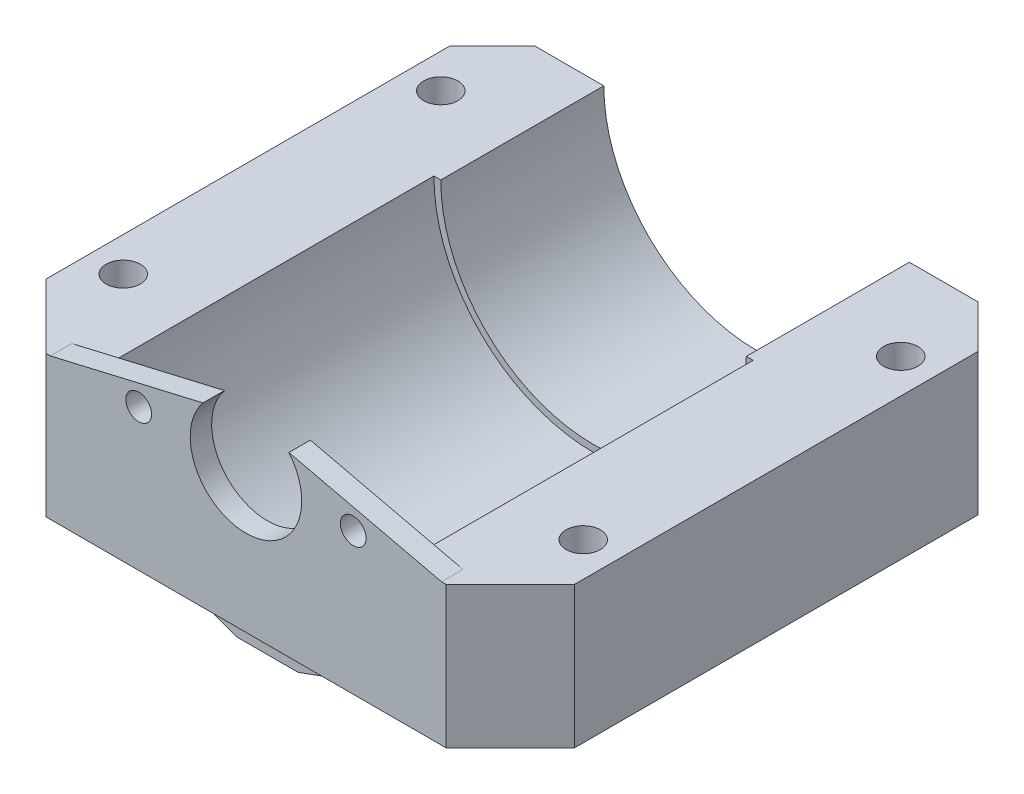
ISO-10303-21;
HEADER;
FILE_DESCRIPTION(('STEP AP214'),'2;1');
FILE_NAME('part.step','',(''),(''),'','','');
FILE_SCHEMA(('AUTOMOTIVE_DESIGN { 1 0 10303 214 1 1 1 1 }'));
ENDSEC;
DATA;
#1=APPLICATION_CONTEXT('core data for automotive mechanical design processes');
#2=APPLICATION_PROTOCOL_DEFINITION('international standard','automotive_design',2000,#1);
#3=PRODUCT_CONTEXT('',#1,'mechanical');
#4=PRODUCT('Part','Part','',(#3));
#5=PRODUCT_RELATED_PRODUCT_CATEGORY('part','',(#4));
#6=PRODUCT_DEFINITION_FORMATION('','',#4);
#7=PRODUCT_DEFINITION_CONTEXT('part definition',#1,'design');
#8=PRODUCT_DEFINITION('design','',#6,#7);
#9=PRODUCT_DEFINITION_SHAPE('','',#8);
#10=(LENGTH_UNIT() NAMED_UNIT(*) SI_UNIT(.MILLI.,.METRE.));
#11=(NAMED_UNIT(*) PLANE_ANGLE_UNIT() SI_UNIT($,.RADIAN.));
#12=(NAMED_UNIT(*) SI_UNIT($,.STERADIAN.) SOLID_ANGLE_UNIT());
#13=UNCERTAINTY_MEASURE_WITH_UNIT(LENGTH_MEASURE(1.E-05),#10,'distance_accuracy_value','');
#14=(GEOMETRIC_REPRESENTATION_CONTEXT(3) GLOBAL_UNCERTAINTY_ASSIGNED_CONTEXT((#13)) GLOBAL_UNIT_ASSIGNED_CONTEXT((#10,
#11,#12)) REPRESENTATION_CONTEXT('',''));
#15=CARTESIAN_POINT('',(0.,0.,0.));
#16=DIRECTION('',(0.,0.,1.));
#17=DIRECTION('',(1.,0.,0.));
#18=AXIS2_PLACEMENT_3D('',#15,#16,#17);
#19=CARTESIAN_POINT('',(0.,20.,19.));
#20=DIRECTION('',(0.,0.,1.));
#21=DIRECTION('',(1.,0.,0.));
#22=AXIS2_PLACEMENT_3D('',#19,#20,#21);
#23=PLANE('',#22);
#24=CARTESIAN_POINT('',(0.,20.,19.));
#25=DIRECTION('',(0.,0.,-1.));
#26=DIRECTION('',(1.,0.,0.));
#27=AXIS2_PLACEMENT_3D('',#24,#25,#26);
#28=CIRCLE('',#27,18.6);
#29=CARTESIAN_POINT('',(18.6,20.,19.));
#30=VERTEX_POINT('',#29);
#31=CARTESIAN_POINT('',(-18.6,20.,19.));
#32=VERTEX_POINT('',#31);
#33=EDGE_CURVE('E348',#30,#32,#28,.T.);
#34=ORIENTED_EDGE('',*,*,#33,.F.);
#35=DIRECTION('',(-1.,0.,0.));
#36=VECTOR('',#35,1.);
#37=CARTESIAN_POINT('',(17.8,20.,19.));
#38=LINE('',#37,#36);
#39=CARTESIAN_POINT('',(17.8,20.,19.));
#40=VERTEX_POINT('',#39);
#41=EDGE_CURVE('E375',#30,#40,#38,.T.);
#42=ORIENTED_EDGE('',*,*,#41,.T.);
#43=CARTESIAN_POINT('',(0.,20.,19.));
#44=DIRECTION('',(0.,0.,-1.));
#45=DIRECTION('',(1.,0.,0.));
#46=AXIS2_PLACEMENT_3D('',#43,#44,#45);
#47=CIRCLE('',#46,17.8);
#48=CARTESIAN_POINT('',(-17.8,20.,19.));
#49=VERTEX_POINT('',#48);
#50=EDGE_CURVE('E369',#40,#49,#47,.T.);
#51=ORIENTED_EDGE('',*,*,#50,.T.);
#52=DIRECTION('',(-1.,0.,0.));
#53=VECTOR('',#52,1.);
#54=CARTESIAN_POINT('',(-22.8,20.,19.));
#55=LINE('',#54,#53);
#56=EDGE_CURVE('E372',#49,#32,#55,.T.);
#57=ORIENTED_EDGE('',*,*,#56,.T.);
#58=EDGE_LOOP('',(#34,#42,#51,#57));
#59=FACE_BOUND('',#58,.T.);
#60=ADVANCED_FACE('F41',(#59),#23,.T.);
#61=CARTESIAN_POINT('',(0.,20.,19.));
#62=DIRECTION('',(0.,0.,-1.));
#63=DIRECTION('',(-1.,0.,0.));
#64=AXIS2_PLACEMENT_3D('',#61,#62,#63);
#65=CYLINDRICAL_SURFACE('',#64,17.8);
#66=CARTESIAN_POINT('',(0.,20.,0.));
#67=DIRECTION('',(0.,0.,-1.));
#68=DIRECTION('',(1.,0.,0.));
#69=AXIS2_PLACEMENT_3D('',#66,#67,#68);
#70=CIRCLE('',#69,17.8);
#71=CARTESIAN_POINT('',(17.8,20.,0.));
#72=VERTEX_POINT('',#71);
#73=CARTESIAN_POINT('',(-17.8,20.,0.));
#74=VERTEX_POINT('',#73);
#75=EDGE_CURVE('E368',#72,#74,#70,.T.);
#76=ORIENTED_EDGE('',*,*,#75,.T.);
#77=DIRECTION('',(0.,0.,-1.));
#78=VECTOR('',#77,1.);
#79=CARTESIAN_POINT('',(-17.8,20.,19.));
#80=LINE('',#79,#78);
#81=EDGE_CURVE('E387',#49,#74,#80,.T.);
#82=ORIENTED_EDGE('',*,*,#81,.F.);
#83=ORIENTED_EDGE('',*,*,#50,.F.);
#84=DIRECTION('',(0.,0.,-1.));
#85=VECTOR('',#84,1.);
#86=CARTESIAN_POINT('',(17.8,20.,19.));
#87=LINE('',#86,#85);
#88=EDGE_CURVE('E377',#40,#72,#87,.T.);
#89=ORIENTED_EDGE('',*,*,#88,.T.);
#90=EDGE_LOOP('',(#76,#82,#83,#89));
#91=FACE_BOUND('',#90,.T.);
#92=ADVANCED_FACE('F461',(#91),#65,.F.);
#93=CARTESIAN_POINT('',(-22.8,20.,19.));
#94=DIRECTION('',(0.,-1.,0.));
#95=DIRECTION('',(0.,0.,-1.));
#96=AXIS2_PLACEMENT_3D('',#93,#94,#95);
#97=PLANE('',#96);
#98=CARTESIAN_POINT('',(-26.8,20.,46.9999999999986));
#99=DIRECTION('',(0.,-1.,0.));
#100=DIRECTION('',(0.,0.,-1.));
#101=AXIS2_PLACEMENT_3D('',#98,#99,#100);
#102=CIRCLE('',#101,2.);
#103=CARTESIAN_POINT('',(-26.8,20.,44.9999999999986));
#104=VERTEX_POINT('',#103);
#105=EDGE_CURVE('E424',#104,#104,#102,.T.);
#106=ORIENTED_EDGE('',*,*,#105,.T.);
#107=EDGE_LOOP('',(#106));
#108=FACE_BOUND('',#107,.T.);
#109=CARTESIAN_POINT('',(-26.8,20.,9.99999999999868));
#110=DIRECTION('',(0.,-1.,0.));
#111=DIRECTION('',(0.,0.,-1.));
#112=AXIS2_PLACEMENT_3D('',#109,#110,#111);
#113=CIRCLE('',#112,2.);
#114=CARTESIAN_POINT('',(-26.8,20.,7.99999999999868));
#115=VERTEX_POINT('',#114);
#116=EDGE_CURVE('E244',#115,#115,#113,.T.);
#117=ORIENTED_EDGE('',*,*,#116,.T.);
#118=EDGE_LOOP('',(#117));
#119=FACE_BOUND('',#118,.T.);
#120=DIRECTION('',(-1.,0.,0.));
#121=VECTOR('',#120,1.);
#122=CARTESIAN_POINT('',(-22.8,20.,0.));
#123=LINE('',#122,#121);
#124=CARTESIAN_POINT('',(-25.8,20.,0.));
#125=VERTEX_POINT('',#124);
#126=EDGE_CURVE('E380',#74,#125,#123,.T.);
#127=ORIENTED_EDGE('',*,*,#126,.T.);
#128=DIRECTION('',(0.707106781186548,0.,-0.707106781186547));
#129=VECTOR('',#128,1.);
#130=CARTESIAN_POINT('',(-25.8,20.,0.));
#131=LINE('',#130,#129);
#132=CARTESIAN_POINT('',(-30.8,20.,5.00000000000001));
#133=VERTEX_POINT('',#132);
#134=EDGE_CURVE('E298',#133,#125,#131,.T.);
#135=ORIENTED_EDGE('',*,*,#134,.F.);
#136=DIRECTION('',(0.,0.,-1.));
#137=VECTOR('',#136,1.);
#138=CARTESIAN_POINT('',(-30.8,20.,5.00000000000001));
#139=LINE('',#138,#137);
#140=CARTESIAN_POINT('',(-30.7999999999999,20.,52.));
#141=VERTEX_POINT('',#140);
#142=EDGE_CURVE('E294',#141,#133,#139,.T.);
#143=ORIENTED_EDGE('',*,*,#142,.F.);
#144=DIRECTION('',(-0.707106781186544,0.,-0.707106781186551));
#145=VECTOR('',#144,1.);
#146=CARTESIAN_POINT('',(-25.8,20.,57.));
#147=LINE('',#146,#145);
#148=CARTESIAN_POINT('',(-23.3,20.,59.5));
#149=VERTEX_POINT('',#148);
#150=EDGE_CURVE('E291',#149,#141,#147,.T.);
#151=ORIENTED_EDGE('',*,*,#150,.F.);
#152=DIRECTION('',(-1.,0.,0.));
#153=VECTOR('',#152,1.);
#154=CARTESIAN_POINT('',(-23.3,20.,59.5));
#155=LINE('',#154,#153);
#156=CARTESIAN_POINT('',(-22.8,20.,59.5));
#157=VERTEX_POINT('',#156);
#158=EDGE_CURVE('E295',#157,#149,#155,.T.);
#159=ORIENTED_EDGE('',*,*,#158,.F.);
#160=DIRECTION('',(0.,0.,-1.));
#161=VECTOR('',#160,1.);
#162=CARTESIAN_POINT('',(-22.8,20.,59.5));
#163=LINE('',#162,#161);
#164=CARTESIAN_POINT('',(-22.8,20.,57.));
#165=VERTEX_POINT('',#164);
#166=EDGE_CURVE('E331',#157,#165,#163,.T.);
#167=ORIENTED_EDGE('',*,*,#166,.T.);
#168=DIRECTION('',(-1.,0.,0.));
#169=VECTOR('',#168,1.);
#170=CARTESIAN_POINT('',(-18.6,20.,57.));
#171=LINE('',#170,#169);
#172=CARTESIAN_POINT('',(-18.6,20.,57.));
#173=VERTEX_POINT('',#172);
#174=EDGE_CURVE('E351',#173,#165,#171,.T.);
#175=ORIENTED_EDGE('',*,*,#174,.F.);
#176=DIRECTION('',(0.,0.,-1.));
#177=VECTOR('',#176,1.);
#178=CARTESIAN_POINT('',(-18.6,20.,57.));
#179=LINE('',#178,#177);
#180=EDGE_CURVE('E365',#173,#32,#179,.T.);
#181=ORIENTED_EDGE('',*,*,#180,.T.);
#182=ORIENTED_EDGE('',*,*,#56,.F.);
#183=ORIENTED_EDGE('',*,*,#81,.T.);
#184=EDGE_LOOP('',(#127,#135,#143,#151,#159,#167,#175,#181,#182,#183));
#185=FACE_BOUND('',#184,.T.);
#186=ADVANCED_FACE('F443',(#108,#119,#185),#97,.F.);
#187=CARTESIAN_POINT('',(22.8,0.,19.));
#188=DIRECTION('',(0.,1.,0.));
#189=DIRECTION('',(0.,0.,1.));
#190=AXIS2_PLACEMENT_3D('',#187,#188,#189);
#191=PLANE('',#190);
#192=DIRECTION('',(1.,0.,0.));
#193=VECTOR('',#192,1.);
#194=CARTESIAN_POINT('',(22.8,0.,0.));
#195=LINE('',#194,#193);
#196=CARTESIAN_POINT('',(-3.5676580638177,0.,0.));
#197=VERTEX_POINT('',#196);
#198=CARTESIAN_POINT('',(3.56765806381765,0.,0.));
#199=VERTEX_POINT('',#198);
#200=EDGE_CURVE('E382',#197,#199,#195,.T.);
#201=ORIENTED_EDGE('',*,*,#200,.T.);
#202=DIRECTION('',(0.,0.,1.));
#203=VECTOR('',#202,1.);
#204=CARTESIAN_POINT('',(3.56765806381765,0.,19.));
#205=LINE('',#204,#203);
#206=CARTESIAN_POINT('',(3.56765806381765,0.,57.));
#207=VERTEX_POINT('',#206);
#208=EDGE_CURVE('E59',#199,#207,#205,.T.);
#209=ORIENTED_EDGE('',*,*,#208,.T.);
#210=DIRECTION('',(1.,0.,0.));
#211=VECTOR('',#210,1.);
#212=CARTESIAN_POINT('',(-22.8,0.,57.));
#213=LINE('',#212,#211);
#214=CARTESIAN_POINT('',(-3.5676580638177,0.,57.));
#215=VERTEX_POINT('',#214);
#216=EDGE_CURVE('E355',#215,#207,#213,.T.);
#217=ORIENTED_EDGE('',*,*,#216,.F.);
#218=DIRECTION('',(0.,0.,-1.));
#219=VECTOR('',#218,1.);
#220=CARTESIAN_POINT('',(-3.5676580638177,0.,19.));
#221=LINE('',#220,#219);
#222=EDGE_CURVE('E410',#215,#197,#221,.T.);
#223=ORIENTED_EDGE('',*,*,#222,.T.);
#224=EDGE_LOOP('',(#201,#209,#217,#223));
#225=FACE_BOUND('',#224,.T.);
#226=ADVANCED_FACE('F481',(#225),#191,.F.);
#227=CARTESIAN_POINT('',(17.8,20.,19.));
#228=DIRECTION('',(0.,-1.,0.));
#229=DIRECTION('',(0.,0.,-1.));
#230=AXIS2_PLACEMENT_3D('',#227,#228,#229);
#231=PLANE('',#230);
#232=CARTESIAN_POINT('',(26.8,20.,9.99999999999868));
#233=DIRECTION('',(0.,-1.,0.));
#234=DIRECTION('',(0.,0.,-1.));
#235=AXIS2_PLACEMENT_3D('',#232,#233,#234);
#236=CIRCLE('',#235,2.);
#237=CARTESIAN_POINT('',(26.8,20.,7.99999999999868));
#238=VERTEX_POINT('',#237);
#239=EDGE_CURVE('E430',#238,#238,#236,.T.);
#240=ORIENTED_EDGE('',*,*,#239,.T.);
#241=EDGE_LOOP('',(#240));
#242=FACE_BOUND('',#241,.T.);
#243=CARTESIAN_POINT('',(26.8,20.,46.9999999999986));
#244=DIRECTION('',(0.,-1.,0.));
#245=DIRECTION('',(0.,0.,-1.));
#246=AXIS2_PLACEMENT_3D('',#243,#244,#245);
#247=CIRCLE('',#246,2.);
#248=CARTESIAN_POINT('',(26.8,20.,44.9999999999986));
#249=VERTEX_POINT('',#248);
#250=EDGE_CURVE('E427',#249,#249,#247,.T.);
#251=ORIENTED_EDGE('',*,*,#250,.T.);
#252=EDGE_LOOP('',(#251));
#253=FACE_BOUND('',#252,.T.);
#254=DIRECTION('',(-1.,0.,0.));
#255=VECTOR('',#254,1.);
#256=CARTESIAN_POINT('',(17.8,20.,0.));
#257=LINE('',#256,#255);
#258=CARTESIAN_POINT('',(25.8,20.,0.));
#259=VERTEX_POINT('',#258);
#260=EDGE_CURVE('E373',#259,#72,#257,.T.);
#261=ORIENTED_EDGE('',*,*,#260,.T.);
#262=ORIENTED_EDGE('',*,*,#88,.F.);
#263=ORIENTED_EDGE('',*,*,#41,.F.);
#264=DIRECTION('',(0.,0.,-1.));
#265=VECTOR('',#264,1.);
#266=CARTESIAN_POINT('',(18.6,20.,57.));
#267=LINE('',#266,#265);
#268=CARTESIAN_POINT('',(18.6,20.,57.));
#269=VERTEX_POINT('',#268);
#270=EDGE_CURVE('E360',#269,#30,#267,.T.);
#271=ORIENTED_EDGE('',*,*,#270,.F.);
#272=DIRECTION('',(-1.,0.,0.));
#273=VECTOR('',#272,1.);
#274=CARTESIAN_POINT('',(22.8,20.,57.));
#275=LINE('',#274,#273);
#276=CARTESIAN_POINT('',(22.8,20.,57.));
#277=VERTEX_POINT('',#276);
#278=EDGE_CURVE('E357',#277,#269,#275,.T.);
#279=ORIENTED_EDGE('',*,*,#278,.F.);
#280=DIRECTION('',(0.,0.,-1.));
#281=VECTOR('',#280,1.);
#282=CARTESIAN_POINT('',(22.8,20.,59.5));
#283=LINE('',#282,#281);
#284=CARTESIAN_POINT('',(22.8,20.,59.5));
#285=VERTEX_POINT('',#284);
#286=EDGE_CURVE('E345',#285,#277,#283,.T.);
#287=ORIENTED_EDGE('',*,*,#286,.F.);
#288=DIRECTION('',(-1.,0.,0.));
#289=VECTOR('',#288,1.);
#290=CARTESIAN_POINT('',(22.8,20.,59.5));
#291=LINE('',#290,#289);
#292=CARTESIAN_POINT('',(23.3,20.,59.5));
#293=VERTEX_POINT('',#292);
#294=EDGE_CURVE('E290',#293,#285,#291,.T.);
#295=ORIENTED_EDGE('',*,*,#294,.F.);
#296=DIRECTION('',(-0.707106781186549,0.,0.707106781186547));
#297=VECTOR('',#296,1.);
#298=CARTESIAN_POINT('',(25.8,20.,57.));
#299=LINE('',#298,#297);
#300=CARTESIAN_POINT('',(30.8,20.,52.));
#301=VERTEX_POINT('',#300);
#302=EDGE_CURVE('E308',#301,#293,#299,.T.);
#303=ORIENTED_EDGE('',*,*,#302,.F.);
#304=DIRECTION('',(0.,0.,1.));
#305=VECTOR('',#304,1.);
#306=CARTESIAN_POINT('',(30.8,20.,52.));
#307=LINE('',#306,#305);
#308=CARTESIAN_POINT('',(30.8,20.,5.00000000000002));
#309=VERTEX_POINT('',#308);
#310=EDGE_CURVE('E305',#309,#301,#307,.T.);
#311=ORIENTED_EDGE('',*,*,#310,.F.);
#312=DIRECTION('',(0.707106781186548,0.,0.707106781186548));
#313=VECTOR('',#312,1.);
#314=CARTESIAN_POINT('',(30.8,20.,5.00000000000001));
#315=LINE('',#314,#313);
#316=EDGE_CURVE('E225',#259,#309,#315,.T.);
#317=ORIENTED_EDGE('',*,*,#316,.F.);
#318=EDGE_LOOP('',(#261,#262,#263,#271,#279,#287,#295,#303,#311,#317));
#319=FACE_BOUND('',#318,.T.);
#320=ADVANCED_FACE('F477',(#242,#253,#319),#231,.F.);
#321=CARTESIAN_POINT('',(0.,20.,0.));
#322=DIRECTION('',(0.,0.,1.));
#323=DIRECTION('',(1.,0.,0.));
#324=AXIS2_PLACEMENT_3D('',#321,#322,#323);
#325=PLANE('',#324);
#326=DIRECTION('',(0.939692620785908,-0.34202014332567,0.));
#327=VECTOR('',#326,1.);
#328=CARTESIAN_POINT('',(-3.5676580638177,0.,0.));
#329=LINE('',#328,#327);
#330=CARTESIAN_POINT('',(-22.8,7.00000000000002,0.));
#331=VERTEX_POINT('',#330);
#332=EDGE_CURVE('E405',#197,#331,#329,.F.);
#333=ORIENTED_EDGE('',*,*,#332,.T.);
#334=DIRECTION('',(0.,1.,0.));
#335=VECTOR('',#334,1.);
#336=CARTESIAN_POINT('',(-22.8,3.5,0.));
#337=LINE('',#336,#335);
#338=CARTESIAN_POINT('',(-22.8,3.5,0.));
#339=VERTEX_POINT('',#338);
#340=EDGE_CURVE('E285',#339,#331,#337,.T.);
#341=ORIENTED_EDGE('',*,*,#340,.F.);
#342=DIRECTION('',(1.,0.,0.));
#343=VECTOR('',#342,1.);
#344=CARTESIAN_POINT('',(-25.8,3.5,0.));
#345=LINE('',#344,#343);
#346=CARTESIAN_POINT('',(-25.8,3.5,0.));
#347=VERTEX_POINT('',#346);
#348=EDGE_CURVE('E264',#347,#339,#345,.T.);
#349=ORIENTED_EDGE('',*,*,#348,.F.);
#350=DIRECTION('',(0.,1.,0.));
#351=VECTOR('',#350,1.);
#352=CARTESIAN_POINT('',(-25.8,20.,0.));
#353=LINE('',#352,#351);
#354=EDGE_CURVE('E394',#347,#125,#353,.T.);
#355=ORIENTED_EDGE('',*,*,#354,.T.);
#356=ORIENTED_EDGE('',*,*,#126,.F.);
#357=ORIENTED_EDGE('',*,*,#75,.F.);
#358=ORIENTED_EDGE('',*,*,#260,.F.);
#359=DIRECTION('',(0.,-1.,0.));
#360=VECTOR('',#359,1.);
#361=CARTESIAN_POINT('',(25.8,20.,0.));
#362=LINE('',#361,#360);
#363=CARTESIAN_POINT('',(25.8,3.50000000000001,0.));
#364=VERTEX_POINT('',#363);
#365=EDGE_CURVE('E397',#259,#364,#362,.T.);
#366=ORIENTED_EDGE('',*,*,#365,.T.);
#367=DIRECTION('',(1.,0.,0.));
#368=VECTOR('',#367,1.);
#369=CARTESIAN_POINT('',(22.8,3.50000000000001,0.));
#370=LINE('',#369,#368);
#371=CARTESIAN_POINT('',(22.8,3.50000000000001,0.));
#372=VERTEX_POINT('',#371);
#373=EDGE_CURVE('E243',#372,#364,#370,.T.);
#374=ORIENTED_EDGE('',*,*,#373,.F.);
#375=DIRECTION('',(0.,1.,0.));
#376=VECTOR('',#375,1.);
#377=CARTESIAN_POINT('',(22.8,3.50000000000001,0.));
#378=LINE('',#377,#376);
#379=CARTESIAN_POINT('',(22.8,7.00000000000001,0.));
#380=VERTEX_POINT('',#379);
#381=EDGE_CURVE('E276',#372,#380,#378,.T.);
#382=ORIENTED_EDGE('',*,*,#381,.T.);
#383=DIRECTION('',(0.939692620785908,0.342020143325669,0.));
#384=VECTOR('',#383,1.);
#385=CARTESIAN_POINT('',(22.8,7.00000000000001,0.));
#386=LINE('',#385,#384);
#387=EDGE_CURVE('E408',#380,#199,#386,.F.);
#388=ORIENTED_EDGE('',*,*,#387,.T.);
#389=ORIENTED_EDGE('',*,*,#200,.F.);
#390=EDGE_LOOP('',(#333,#341,#349,#355,#356,#357,#358,#366,#374,#382,#388,#389));
#391=FACE_BOUND('',#390,.T.);
#392=ADVANCED_FACE('F474',(#391),#325,.F.);
#393=CARTESIAN_POINT('',(0.,20.,57.));
#394=DIRECTION('',(0.,0.,-1.));
#395=DIRECTION('',(-1.,0.,0.));
#396=AXIS2_PLACEMENT_3D('',#393,#394,#395);
#397=CYLINDRICAL_SURFACE('',#396,18.6);
#398=ORIENTED_EDGE('',*,*,#33,.T.);
#399=ORIENTED_EDGE('',*,*,#180,.F.);
#400=CARTESIAN_POINT('',(0.,20.,57.));
#401=DIRECTION('',(0.,0.,-1.));
#402=DIRECTION('',(1.,0.,0.));
#403=AXIS2_PLACEMENT_3D('',#400,#401,#402);
#404=CIRCLE('',#403,18.6);
#405=CARTESIAN_POINT('',(-8.58545281275255,3.5,57.));
#406=VERTEX_POINT('',#405);
#407=EDGE_CURVE('E353',#406,#173,#404,.T.);
#408=ORIENTED_EDGE('',*,*,#407,.F.);
#409=CARTESIAN_POINT('',(8.58545281275255,3.5,57.));
#410=VERTEX_POINT('',#409);
#411=EDGE_CURVE('E352',#410,#406,#404,.T.);
#412=ORIENTED_EDGE('',*,*,#411,.F.);
#413=EDGE_CURVE('E349',#269,#410,#404,.T.);
#414=ORIENTED_EDGE('',*,*,#413,.F.);
#415=ORIENTED_EDGE('',*,*,#270,.T.);
#416=EDGE_LOOP('',(#398,#399,#408,#412,#414,#415));
#417=FACE_BOUND('',#416,.T.);
#418=ADVANCED_FACE('F472',(#417),#397,.F.);
#419=CARTESIAN_POINT('',(0.,20.,57.));
#420=DIRECTION('',(0.,0.,1.));
#421=DIRECTION('',(1.,0.,0.));
#422=AXIS2_PLACEMENT_3D('',#419,#420,#421);
#423=PLANE('',#422);
#424=DIRECTION('',(1.,0.,0.));
#425=VECTOR('',#424,1.);
#426=CARTESIAN_POINT('',(-22.8,3.5,57.));
#427=LINE('',#426,#425);
#428=CARTESIAN_POINT('',(-13.1838290319089,3.5,57.));
#429=VERTEX_POINT('',#428);
#430=EDGE_CURVE('E273',#429,#406,#427,.T.);
#431=ORIENTED_EDGE('',*,*,#430,.F.);
#432=DIRECTION('',(-0.939692620785908,0.34202014332567,0.));
#433=VECTOR('',#432,1.);
#434=CARTESIAN_POINT('',(-6.84521281140618,1.19293236930009,57.));
#435=LINE('',#434,#433);
#436=EDGE_CURVE('E66',#429,#215,#435,.F.);
#437=ORIENTED_EDGE('',*,*,#436,.T.);
#438=ORIENTED_EDGE('',*,*,#216,.T.);
#439=DIRECTION('',(-0.939692620785908,-0.342020143325669,0.));
#440=VECTOR('',#439,1.);
#441=CARTESIAN_POINT('',(6.84521281140616,1.1929323693001,57.));
#442=LINE('',#441,#440);
#443=CARTESIAN_POINT('',(13.1838290319088,3.5,57.));
#444=VERTEX_POINT('',#443);
#445=EDGE_CURVE('E416',#207,#444,#442,.F.);
#446=ORIENTED_EDGE('',*,*,#445,.T.);
#447=EDGE_CURVE('E528',#410,#444,#427,.T.);
#448=ORIENTED_EDGE('',*,*,#447,.F.);
#449=ORIENTED_EDGE('',*,*,#411,.T.);
#450=EDGE_LOOP('',(#431,#437,#438,#446,#448,#449));
#451=FACE_BOUND('',#450,.T.);
#452=ADVANCED_FACE('F525',(#451),#423,.T.);
#453=CARTESIAN_POINT('',(-30.8,0.,0.));
#454=DIRECTION('',(1.,0.,0.));
#455=DIRECTION('',(0.,0.,-1.));
#456=AXIS2_PLACEMENT_3D('',#453,#454,#455);
#457=PLANE('',#456);
#458=DIRECTION('',(0.,1.,0.));
#459=VECTOR('',#458,1.);
#460=CARTESIAN_POINT('',(-30.8,13.7,52.));
#461=LINE('',#460,#459);
#462=CARTESIAN_POINT('',(-30.8,3.5,52.));
#463=VERTEX_POINT('',#462);
#464=EDGE_CURVE('E399',#463,#141,#461,.T.);
#465=ORIENTED_EDGE('',*,*,#464,.T.);
#466=ORIENTED_EDGE('',*,*,#142,.T.);
#467=DIRECTION('',(0.,-1.,0.));
#468=VECTOR('',#467,1.);
#469=CARTESIAN_POINT('',(-30.8,0.,5.00000000000001));
#470=LINE('',#469,#468);
#471=CARTESIAN_POINT('',(-30.8,3.5,5.00000000000001));
#472=VERTEX_POINT('',#471);
#473=EDGE_CURVE('E401',#133,#472,#470,.T.);
#474=ORIENTED_EDGE('',*,*,#473,.T.);
#475=DIRECTION('',(0.,0.,-1.));
#476=VECTOR('',#475,1.);
#477=CARTESIAN_POINT('',(-30.8,3.5,52.));
#478=LINE('',#477,#476);
#479=EDGE_CURVE('E258',#463,#472,#478,.T.);
#480=ORIENTED_EDGE('',*,*,#479,.F.);
#481=EDGE_LOOP('',(#465,#466,#474,#480));
#482=FACE_BOUND('',#481,.T.);
#483=ADVANCED_FACE('F585',(#482),#457,.F.);
#484=CARTESIAN_POINT('',(30.8,0.,0.));
#485=DIRECTION('',(-1.,0.,0.));
#486=DIRECTION('',(0.,-1.,0.));
#487=AXIS2_PLACEMENT_3D('',#484,#485,#486);
#488=PLANE('',#487);
#489=DIRECTION('',(0.,1.,0.));
#490=VECTOR('',#489,1.);
#491=CARTESIAN_POINT('',(30.8,0.,5.00000000000002));
#492=LINE('',#491,#490);
#493=CARTESIAN_POINT('',(30.8,3.50000000000001,5.00000000000002));
#494=VERTEX_POINT('',#493);
#495=EDGE_CURVE('E218',#494,#309,#492,.T.);
#496=ORIENTED_EDGE('',*,*,#495,.T.);
#497=ORIENTED_EDGE('',*,*,#310,.T.);
#498=DIRECTION('',(0.,-1.,0.));
#499=VECTOR('',#498,1.);
#500=CARTESIAN_POINT('',(30.8,11.5,52.));
#501=LINE('',#500,#499);
#502=CARTESIAN_POINT('',(30.8,3.50000000000001,52.));
#503=VERTEX_POINT('',#502);
#504=EDGE_CURVE('E229',#301,#503,#501,.T.);
#505=ORIENTED_EDGE('',*,*,#504,.T.);
#506=DIRECTION('',(0.,0.,1.));
#507=VECTOR('',#506,1.);
#508=CARTESIAN_POINT('',(30.8,3.50000000000001,5.00000000000002));
#509=LINE('',#508,#507);
#510=EDGE_CURVE('E233',#494,#503,#509,.T.);
#511=ORIENTED_EDGE('',*,*,#510,.F.);
#512=EDGE_LOOP('',(#496,#497,#505,#511));
#513=FACE_BOUND('',#512,.T.);
#514=ADVANCED_FACE('F234',(#513),#488,.F.);
#515=CARTESIAN_POINT('',(25.8,20.,57.));
#516=DIRECTION('',(0.707106781186547,0.,0.707106781186548));
#517=DIRECTION('',(0.,-1.,0.));
#518=AXIS2_PLACEMENT_3D('',#515,#516,#517);
#519=PLANE('',#518);
#520=DIRECTION('',(0.,1.,0.));
#521=VECTOR('',#520,1.);
#522=CARTESIAN_POINT('',(23.3,20.,59.5));
#523=LINE('',#522,#521);
#524=CARTESIAN_POINT('',(23.3,3.50000000000001,59.5));
#525=VERTEX_POINT('',#524);
#526=EDGE_CURVE('E51',#525,#293,#523,.T.);
#527=ORIENTED_EDGE('',*,*,#526,.F.);
#528=DIRECTION('',(-0.707106781186549,0.,0.707106781186547));
#529=VECTOR('',#528,1.);
#530=CARTESIAN_POINT('',(30.8,3.50000000000001,52.));
#531=LINE('',#530,#529);
#532=EDGE_CURVE('E238',#503,#525,#531,.T.);
#533=ORIENTED_EDGE('',*,*,#532,.F.);
#534=ORIENTED_EDGE('',*,*,#504,.F.);
#535=ORIENTED_EDGE('',*,*,#302,.T.);
#536=EDGE_LOOP('',(#527,#533,#534,#535));
#537=FACE_BOUND('',#536,.T.);
#538=DIRECTION('',(0.,1.,0.));
#539=VECTOR('',#538,1.);
#540=CARTESIAN_POINT('',(25.8,13.7,57.));
#541=LINE('',#540,#539);
#542=CARTESIAN_POINT('',(25.8,11.5,57.));
#543=VERTEX_POINT('',#542);
#544=CARTESIAN_POINT('',(25.8,13.7,57.));
#545=VERTEX_POINT('',#544);
#546=EDGE_CURVE('E230',#543,#545,#541,.T.);
#547=ORIENTED_EDGE('',*,*,#546,.F.);
#548=ORIENTED_EDGE('',*,*,#546,.T.);
#549=EDGE_LOOP('',(#547,#548));
#550=FACE_BOUND('',#549,.T.);
#551=ADVANCED_FACE('F486',(#537,#550),#519,.T.);
#552=CARTESIAN_POINT('',(25.8,20.,0.));
#553=DIRECTION('',(-0.707106781186547,0.,0.707106781186547));
#554=DIRECTION('',(0.,-1.,0.));
#555=AXIS2_PLACEMENT_3D('',#552,#553,#554);
#556=PLANE('',#555);
#557=ORIENTED_EDGE('',*,*,#365,.F.);
#558=ORIENTED_EDGE('',*,*,#316,.T.);
#559=ORIENTED_EDGE('',*,*,#495,.F.);
#560=DIRECTION('',(0.707106781186547,0.,0.707106781186547));
#561=VECTOR('',#560,1.);
#562=CARTESIAN_POINT('',(25.8,3.50000000000001,0.));
#563=LINE('',#562,#561);
#564=EDGE_CURVE('E223',#364,#494,#563,.T.);
#565=ORIENTED_EDGE('',*,*,#564,.F.);
#566=EDGE_LOOP('',(#557,#558,#559,#565));
#567=FACE_BOUND('',#566,.T.);
#568=ADVANCED_FACE('F221',(#567),#556,.F.);
#569=CARTESIAN_POINT('',(-30.8,0.,5.00000000000001));
#570=DIRECTION('',(0.707106781186547,0.,0.707106781186548));
#571=DIRECTION('',(0.,-1.,0.));
#572=AXIS2_PLACEMENT_3D('',#569,#570,#571);
#573=PLANE('',#572);
#574=ORIENTED_EDGE('',*,*,#473,.F.);
#575=ORIENTED_EDGE('',*,*,#134,.T.);
#576=ORIENTED_EDGE('',*,*,#354,.F.);
#577=DIRECTION('',(0.707106781186548,0.,-0.707106781186547));
#578=VECTOR('',#577,1.);
#579=CARTESIAN_POINT('',(-30.8,3.5,5.00000000000001));
#580=LINE('',#579,#578);
#581=EDGE_CURVE('E261',#472,#347,#580,.T.);
#582=ORIENTED_EDGE('',*,*,#581,.F.);
#583=EDGE_LOOP('',(#574,#575,#576,#582));
#584=FACE_BOUND('',#583,.T.);
#585=ADVANCED_FACE('F498',(#584),#573,.F.);
#586=CARTESIAN_POINT('',(-30.8,0.,52.));
#587=DIRECTION('',(-0.707106781186547,0.,0.707106781186549));
#588=DIRECTION('',(0.,-1.,0.));
#589=AXIS2_PLACEMENT_3D('',#586,#587,#588);
#590=PLANE('',#589);
#591=ORIENTED_EDGE('',*,*,#464,.F.);
#592=DIRECTION('',(-0.707106781186544,0.,-0.707106781186551));
#593=VECTOR('',#592,1.);
#594=CARTESIAN_POINT('',(-23.3,3.5,59.5));
#595=LINE('',#594,#593);
#596=CARTESIAN_POINT('',(-23.3,3.5,59.5));
#597=VERTEX_POINT('',#596);
#598=EDGE_CURVE('E255',#597,#463,#595,.T.);
#599=ORIENTED_EDGE('',*,*,#598,.F.);
#600=DIRECTION('',(0.,-1.,0.));
#601=VECTOR('',#600,1.);
#602=CARTESIAN_POINT('',(-23.3,0.,59.5));
#603=LINE('',#602,#601);
#604=EDGE_CURVE('E11',#149,#597,#603,.T.);
#605=ORIENTED_EDGE('',*,*,#604,.F.);
#606=ORIENTED_EDGE('',*,*,#150,.T.);
#607=EDGE_LOOP('',(#591,#599,#605,#606));
#608=FACE_BOUND('',#607,.T.);
#609=DIRECTION('',(0.,-1.,0.));
#610=VECTOR('',#609,1.);
#611=CARTESIAN_POINT('',(-25.8,11.5,57.));
#612=LINE('',#611,#610);
#613=CARTESIAN_POINT('',(-25.8,13.7,57.));
#614=VERTEX_POINT('',#613);
#615=CARTESIAN_POINT('',(-25.8,11.5,57.));
#616=VERTEX_POINT('',#615);
#617=EDGE_CURVE('E390',#614,#616,#612,.T.);
#618=ORIENTED_EDGE('',*,*,#617,.T.);
#619=ORIENTED_EDGE('',*,*,#617,.F.);
#620=EDGE_LOOP('',(#618,#619));
#621=FACE_BOUND('',#620,.T.);
#622=ADVANCED_FACE('F504',(#608,#621),#590,.T.);
#623=CARTESIAN_POINT('',(22.8,7.00000000000001,19.));
#624=DIRECTION('',(-0.342020143325669,0.939692620785908,0.));
#625=DIRECTION('',(0.,0.,-1.));
#626=AXIS2_PLACEMENT_3D('',#623,#624,#625);
#627=PLANE('',#626);
#628=ORIENTED_EDGE('',*,*,#445,.F.);
#629=ORIENTED_EDGE('',*,*,#208,.F.);
#630=ORIENTED_EDGE('',*,*,#387,.F.);
#631=DIRECTION('',(0.,0.,-1.));
#632=VECTOR('',#631,1.);
#633=CARTESIAN_POINT('',(22.8,7.00000000000001,19.));
#634=LINE('',#633,#632);
#635=CARTESIAN_POINT('',(22.8,7.00000000000001,57.));
#636=VERTEX_POINT('',#635);
#637=EDGE_CURVE('E403',#636,#380,#634,.T.);
#638=ORIENTED_EDGE('',*,*,#637,.F.);
#639=DIRECTION('',(0.939692620785908,0.342020143325669,0.));
#640=VECTOR('',#639,1.);
#641=CARTESIAN_POINT('',(22.8,7.00000000000001,57.));
#642=LINE('',#641,#640);
#643=EDGE_CURVE('E287',#636,#444,#642,.F.);
#644=ORIENTED_EDGE('',*,*,#643,.T.);
#645=EDGE_LOOP('',(#628,#629,#630,#638,#644));
#646=FACE_BOUND('',#645,.T.);
#647=ADVANCED_FACE('F510',(#646),#627,.F.);
#648=CARTESIAN_POINT('',(-3.5676580638177,0.,19.));
#649=DIRECTION('',(0.34202014332567,0.939692620785908,0.));
#650=DIRECTION('',(0.,0.,-1.));
#651=AXIS2_PLACEMENT_3D('',#648,#649,#650);
#652=PLANE('',#651);
#653=CARTESIAN_POINT('',(-22.8,7.00000000000002,57.));
#654=VERTEX_POINT('',#653);
#655=EDGE_CURVE('E414',#654,#429,#435,.F.);
#656=ORIENTED_EDGE('',*,*,#655,.F.);
#657=DIRECTION('',(0.,0.,1.));
#658=VECTOR('',#657,1.);
#659=CARTESIAN_POINT('',(-22.8,7.00000000000001,19.));
#660=LINE('',#659,#658);
#661=EDGE_CURVE('E419',#331,#654,#660,.T.);
#662=ORIENTED_EDGE('',*,*,#661,.F.);
#663=ORIENTED_EDGE('',*,*,#332,.F.);
#664=ORIENTED_EDGE('',*,*,#222,.F.);
#665=ORIENTED_EDGE('',*,*,#436,.F.);
#666=EDGE_LOOP('',(#656,#662,#663,#664,#665));
#667=FACE_BOUND('',#666,.T.);
#668=ADVANCED_FACE('F44',(#667),#652,.F.);
#669=CARTESIAN_POINT('',(0.,20.,57.));
#670=DIRECTION('',(0.,0.,1.));
#671=DIRECTION('',(1.,0.,0.));
#672=AXIS2_PLACEMENT_3D('',#669,#670,#671);
#673=PLANE('',#672);
#674=CARTESIAN_POINT('',(12.5,20.,57.));
#675=DIRECTION('',(0.,0.,1.));
#676=DIRECTION('',(1.,0.,0.));
#677=AXIS2_PLACEMENT_3D('',#674,#675,#676);
#678=CIRCLE('',#677,1.5);
#679=CARTESIAN_POINT('',(14.,20.,57.));
#680=VERTEX_POINT('',#679);
#681=EDGE_CURVE('E315',#680,#680,#678,.T.);
#682=ORIENTED_EDGE('',*,*,#681,.T.);
#683=EDGE_LOOP('',(#682));
#684=FACE_BOUND('',#683,.T.);
#685=CARTESIAN_POINT('',(-12.5,20.,57.));
#686=DIRECTION('',(0.,0.,1.));
#687=DIRECTION('',(1.,0.,0.));
#688=AXIS2_PLACEMENT_3D('',#685,#686,#687);
#689=CIRCLE('',#688,1.49999999999998);
#690=CARTESIAN_POINT('',(-11.,20.,57.));
#691=VERTEX_POINT('',#690);
#692=EDGE_CURVE('E301',#691,#691,#689,.T.);
#693=ORIENTED_EDGE('',*,*,#692,.T.);
#694=EDGE_LOOP('',(#693));
#695=FACE_BOUND('',#694,.T.);
#696=DIRECTION('',(-0.973873794841784,0.227089919900605,0.));
#697=VECTOR('',#696,1.);
#698=CARTESIAN_POINT('',(5.00274924416566,24.15,57.));
#699=LINE('',#698,#697);
#700=CARTESIAN_POINT('',(5.00274924416566,24.15,57.));
#701=VERTEX_POINT('',#700);
#702=EDGE_CURVE('E321',#277,#701,#699,.T.);
#703=ORIENTED_EDGE('',*,*,#702,.F.);
#704=ORIENTED_EDGE('',*,*,#278,.T.);
#705=ORIENTED_EDGE('',*,*,#413,.T.);
#706=EDGE_CURVE('E547',#406,#410,#427,.T.);
#707=ORIENTED_EDGE('',*,*,#706,.F.);
#708=ORIENTED_EDGE('',*,*,#407,.T.);
#709=ORIENTED_EDGE('',*,*,#174,.T.);
#710=DIRECTION('',(-0.973873794841784,-0.227089919900606,0.));
#711=VECTOR('',#710,1.);
#712=CARTESIAN_POINT('',(-22.8,20.,57.));
#713=LINE('',#712,#711);
#714=CARTESIAN_POINT('',(-5.00274924416566,24.15,57.));
#715=VERTEX_POINT('',#714);
#716=EDGE_CURVE('E327',#715,#165,#713,.T.);
#717=ORIENTED_EDGE('',*,*,#716,.F.);
#718=CARTESIAN_POINT('',(0.,20.,57.));
#719=DIRECTION('',(0.,0.,-1.));
#720=DIRECTION('',(1.,0.,0.));
#721=AXIS2_PLACEMENT_3D('',#718,#719,#720);
#722=CIRCLE('',#721,6.5);
#723=EDGE_CURVE('E333',#701,#715,#722,.T.);
#724=ORIENTED_EDGE('',*,*,#723,.F.);
#725=EDGE_LOOP('',(#703,#704,#705,#707,#708,#709,#717,#724));
#726=FACE_BOUND('',#725,.T.);
#727=ADVANCED_FACE('F519',(#684,#695,#726),#673,.F.);
#728=CARTESIAN_POINT('',(0.,20.,59.5));
#729=DIRECTION('',(0.,0.,1.));
#730=DIRECTION('',(1.,0.,0.));
#731=AXIS2_PLACEMENT_3D('',#728,#729,#730);
#732=PLANE('',#731);
#733=ORIENTED_EDGE('',*,*,#158,.T.);
#734=ORIENTED_EDGE('',*,*,#604,.T.);
#735=DIRECTION('',(-1.,0.,0.));
#736=VECTOR('',#735,1.);
#737=CARTESIAN_POINT('',(23.3,3.50000000000001,59.5));
#738=LINE('',#737,#736);
#739=EDGE_CURVE('E252',#525,#597,#738,.T.);
#740=ORIENTED_EDGE('',*,*,#739,.F.);
#741=ORIENTED_EDGE('',*,*,#526,.T.);
#742=ORIENTED_EDGE('',*,*,#294,.T.);
#743=DIRECTION('',(-0.973873794841784,0.227089919900605,0.));
#744=VECTOR('',#743,1.);
#745=CARTESIAN_POINT('',(5.00274924416566,24.15,59.5));
#746=LINE('',#745,#744);
#747=CARTESIAN_POINT('',(5.00274924416566,24.15,59.5));
#748=VERTEX_POINT('',#747);
#749=EDGE_CURVE('E324',#285,#748,#746,.T.);
#750=ORIENTED_EDGE('',*,*,#749,.T.);
#751=CARTESIAN_POINT('',(0.,20.,59.5));
#752=DIRECTION('',(0.,0.,-1.));
#753=DIRECTION('',(1.,0.,0.));
#754=AXIS2_PLACEMENT_3D('',#751,#752,#753);
#755=CIRCLE('',#754,6.5);
#756=CARTESIAN_POINT('',(-5.00274924416566,24.15,59.5));
#757=VERTEX_POINT('',#756);
#758=EDGE_CURVE('E326',#748,#757,#755,.T.);
#759=ORIENTED_EDGE('',*,*,#758,.T.);
#760=DIRECTION('',(-0.973873794841784,-0.227089919900606,0.));
#761=VECTOR('',#760,1.);
#762=CARTESIAN_POINT('',(-22.8,20.,59.5));
#763=LINE('',#762,#761);
#764=EDGE_CURVE('E329',#757,#157,#763,.T.);
#765=ORIENTED_EDGE('',*,*,#764,.T.);
#766=EDGE_LOOP('',(#733,#734,#740,#741,#742,#750,#759,#765));
#767=FACE_BOUND('',#766,.T.);
#768=CARTESIAN_POINT('',(12.5,20.,59.5));
#769=DIRECTION('',(0.,0.,1.));
#770=DIRECTION('',(1.,0.,0.));
#771=AXIS2_PLACEMENT_3D('',#768,#769,#770);
#772=CIRCLE('',#771,1.5);
#773=CARTESIAN_POINT('',(14.,20.,59.5));
#774=VERTEX_POINT('',#773);
#775=EDGE_CURVE('E318',#774,#774,#772,.T.);
#776=ORIENTED_EDGE('',*,*,#775,.F.);
#777=EDGE_LOOP('',(#776));
#778=FACE_BOUND('',#777,.T.);
#779=CARTESIAN_POINT('',(-12.5,20.,59.5));
#780=DIRECTION('',(0.,0.,1.));
#781=DIRECTION('',(1.,0.,0.));
#782=AXIS2_PLACEMENT_3D('',#779,#780,#781);
#783=CIRCLE('',#782,1.49999999999998);
#784=CARTESIAN_POINT('',(-11.,20.,59.5));
#785=VERTEX_POINT('',#784);
#786=EDGE_CURVE('E312',#785,#785,#783,.T.);
#787=ORIENTED_EDGE('',*,*,#786,.F.);
#788=EDGE_LOOP('',(#787));
#789=FACE_BOUND('',#788,.T.);
#790=ADVANCED_FACE('F576',(#767,#778,#789),#732,.T.);
#791=CARTESIAN_POINT('',(5.00274924416566,24.15,59.5));
#792=DIRECTION('',(-0.227089919900605,-0.973873794841784,0.));
#793=DIRECTION('',(0.973873794841784,-0.227089919900605,0.));
#794=AXIS2_PLACEMENT_3D('',#791,#792,#793);
#795=PLANE('',#794);
#796=ORIENTED_EDGE('',*,*,#702,.T.);
#797=DIRECTION('',(0.,0.,-1.));
#798=VECTOR('',#797,1.);
#799=CARTESIAN_POINT('',(5.00274924416566,24.15,59.5));
#800=LINE('',#799,#798);
#801=EDGE_CURVE('E342',#748,#701,#800,.T.);
#802=ORIENTED_EDGE('',*,*,#801,.F.);
#803=ORIENTED_EDGE('',*,*,#749,.F.);
#804=ORIENTED_EDGE('',*,*,#286,.T.);
#805=EDGE_LOOP('',(#796,#802,#803,#804));
#806=FACE_BOUND('',#805,.T.);
#807=ADVANCED_FACE('F570',(#806),#795,.F.);
#808=CARTESIAN_POINT('',(0.,20.,59.5));
#809=DIRECTION('',(0.,0.,-1.));
#810=DIRECTION('',(-1.,0.,0.));
#811=AXIS2_PLACEMENT_3D('',#808,#809,#810);
#812=CYLINDRICAL_SURFACE('',#811,6.5);
#813=ORIENTED_EDGE('',*,*,#723,.T.);
#814=DIRECTION('',(0.,0.,-1.));
#815=VECTOR('',#814,1.);
#816=CARTESIAN_POINT('',(-5.00274924416566,24.15,59.5));
#817=LINE('',#816,#815);
#818=EDGE_CURVE('E339',#757,#715,#817,.T.);
#819=ORIENTED_EDGE('',*,*,#818,.F.);
#820=ORIENTED_EDGE('',*,*,#758,.F.);
#821=ORIENTED_EDGE('',*,*,#801,.T.);
#822=EDGE_LOOP('',(#813,#819,#820,#821));
#823=FACE_BOUND('',#822,.T.);
#824=ADVANCED_FACE('F566',(#823),#812,.F.);
#825=CARTESIAN_POINT('',(-22.8,20.,59.5));
#826=DIRECTION('',(0.227089919900606,-0.973873794841784,0.));
#827=DIRECTION('',(0.973873794841784,0.227089919900606,0.));
#828=AXIS2_PLACEMENT_3D('',#825,#826,#827);
#829=PLANE('',#828);
#830=ORIENTED_EDGE('',*,*,#716,.T.);
#831=ORIENTED_EDGE('',*,*,#166,.F.);
#832=ORIENTED_EDGE('',*,*,#764,.F.);
#833=ORIENTED_EDGE('',*,*,#818,.T.);
#834=EDGE_LOOP('',(#830,#831,#832,#833));
#835=FACE_BOUND('',#834,.T.);
#836=ADVANCED_FACE('F562',(#835),#829,.F.);
#837=CARTESIAN_POINT('',(12.5,20.,59.5));
#838=DIRECTION('',(0.,0.,-1.));
#839=DIRECTION('',(-1.,0.,0.));
#840=AXIS2_PLACEMENT_3D('',#837,#838,#839);
#841=CYLINDRICAL_SURFACE('',#840,1.5);
#842=ORIENTED_EDGE('',*,*,#775,.T.);
#843=EDGE_LOOP('',(#842));
#844=FACE_BOUND('',#843,.T.);
#845=ORIENTED_EDGE('',*,*,#681,.F.);
#846=EDGE_LOOP('',(#845));
#847=FACE_BOUND('',#846,.T.);
#848=ADVANCED_FACE('F612',(#844,#847),#841,.F.);
#849=CARTESIAN_POINT('',(-12.5,20.,59.5));
#850=DIRECTION('',(0.,0.,-1.));
#851=DIRECTION('',(-1.,0.,0.));
#852=AXIS2_PLACEMENT_3D('',#849,#850,#851);
#853=CYLINDRICAL_SURFACE('',#852,1.49999999999998);
#854=ORIENTED_EDGE('',*,*,#786,.T.);
#855=EDGE_LOOP('',(#854));
#856=FACE_BOUND('',#855,.T.);
#857=ORIENTED_EDGE('',*,*,#692,.F.);
#858=EDGE_LOOP('',(#857));
#859=FACE_BOUND('',#858,.T.);
#860=ADVANCED_FACE('F607',(#856,#859),#853,.F.);
#861=CARTESIAN_POINT('',(16.5441832678437,3.50000000000001,57.));
#862=DIRECTION('',(0.,0.,1.));
#863=DIRECTION('',(1.,0.,0.));
#864=AXIS2_PLACEMENT_3D('',#861,#862,#863);
#865=PLANE('',#864);
#866=ORIENTED_EDGE('',*,*,#643,.F.);
#867=DIRECTION('',(0.,1.,0.));
#868=VECTOR('',#867,1.);
#869=CARTESIAN_POINT('',(22.8,3.50000000000001,57.));
#870=LINE('',#869,#868);
#871=CARTESIAN_POINT('',(22.8,3.50000000000001,57.));
#872=VERTEX_POINT('',#871);
#873=EDGE_CURVE('E279',#872,#636,#870,.T.);
#874=ORIENTED_EDGE('',*,*,#873,.F.);
#875=EDGE_CURVE('E268',#444,#872,#427,.T.);
#876=ORIENTED_EDGE('',*,*,#875,.F.);
#877=EDGE_LOOP('',(#866,#874,#876));
#878=FACE_BOUND('',#877,.T.);
#879=ADVANCED_FACE('F543',(#878),#865,.F.);
#880=CARTESIAN_POINT('',(-22.8,3.5,0.));
#881=DIRECTION('',(-1.,0.,0.));
#882=DIRECTION('',(0.,-1.,0.));
#883=AXIS2_PLACEMENT_3D('',#880,#881,#882);
#884=PLANE('',#883);
#885=ORIENTED_EDGE('',*,*,#661,.T.);
#886=DIRECTION('',(0.,1.,0.));
#887=VECTOR('',#886,1.);
#888=CARTESIAN_POINT('',(-22.8,3.5,57.));
#889=LINE('',#888,#887);
#890=CARTESIAN_POINT('',(-22.8,3.5,57.));
#891=VERTEX_POINT('',#890);
#892=EDGE_CURVE('E282',#891,#654,#889,.T.);
#893=ORIENTED_EDGE('',*,*,#892,.F.);
#894=DIRECTION('',(0.,0.,1.));
#895=VECTOR('',#894,1.);
#896=CARTESIAN_POINT('',(-22.8,3.5,0.));
#897=LINE('',#896,#895);
#898=EDGE_CURVE('E266',#339,#891,#897,.T.);
#899=ORIENTED_EDGE('',*,*,#898,.F.);
#900=ORIENTED_EDGE('',*,*,#340,.T.);
#901=EDGE_LOOP('',(#885,#893,#899,#900));
#902=FACE_BOUND('',#901,.T.);
#903=ADVANCED_FACE('F595',(#902),#884,.F.);
#904=ORIENTED_EDGE('',*,*,#655,.T.);
#905=EDGE_CURVE('E269',#891,#429,#427,.T.);
#906=ORIENTED_EDGE('',*,*,#905,.F.);
#907=ORIENTED_EDGE('',*,*,#892,.T.);
#908=EDGE_LOOP('',(#904,#906,#907));
#909=FACE_BOUND('',#908,.T.);
#910=ADVANCED_FACE('F597',(#909),#865,.F.);
#911=CARTESIAN_POINT('',(22.8,3.50000000000001,57.));
#912=DIRECTION('',(1.,0.,0.));
#913=DIRECTION('',(0.,1.,0.));
#914=AXIS2_PLACEMENT_3D('',#911,#912,#913);
#915=PLANE('',#914);
#916=ORIENTED_EDGE('',*,*,#637,.T.);
#917=ORIENTED_EDGE('',*,*,#381,.F.);
#918=DIRECTION('',(0.,0.,-1.));
#919=VECTOR('',#918,1.);
#920=CARTESIAN_POINT('',(22.8,3.50000000000001,57.));
#921=LINE('',#920,#919);
#922=EDGE_CURVE('E272',#872,#372,#921,.T.);
#923=ORIENTED_EDGE('',*,*,#922,.F.);
#924=ORIENTED_EDGE('',*,*,#873,.T.);
#925=EDGE_LOOP('',(#916,#917,#923,#924));
#926=FACE_BOUND('',#925,.T.);
#927=ADVANCED_FACE('F539',(#926),#915,.F.);
#928=CARTESIAN_POINT('',(0.,3.50000000000001,0.));
#929=DIRECTION('',(0.,-1.,0.));
#930=DIRECTION('',(0.,0.,-1.));
#931=AXIS2_PLACEMENT_3D('',#928,#929,#930);
#932=PLANE('',#931);
#933=CARTESIAN_POINT('',(26.8,3.50000000000001,9.99999999999868));
#934=DIRECTION('',(0.,-1.,0.));
#935=DIRECTION('',(0.,0.,-1.));
#936=AXIS2_PLACEMENT_3D('',#933,#934,#935);
#937=CIRCLE('',#936,2.);
#938=CARTESIAN_POINT('',(26.8,3.50000000000001,7.99999999999868));
#939=VERTEX_POINT('',#938);
#940=EDGE_CURVE('E46',#939,#939,#937,.T.);
#941=ORIENTED_EDGE('',*,*,#940,.F.);
#942=EDGE_LOOP('',(#941));
#943=FACE_BOUND('',#942,.T.);
#944=CARTESIAN_POINT('',(26.8,3.50000000000001,46.9999999999986));
#945=DIRECTION('',(0.,-1.,0.));
#946=DIRECTION('',(0.,0.,-1.));
#947=AXIS2_PLACEMENT_3D('',#944,#945,#946);
#948=CIRCLE('',#947,2.);
#949=CARTESIAN_POINT('',(26.8,3.50000000000001,44.9999999999986));
#950=VERTEX_POINT('',#949);
#951=EDGE_CURVE('E428',#950,#950,#948,.T.);
#952=ORIENTED_EDGE('',*,*,#951,.F.);
#953=EDGE_LOOP('',(#952));
#954=FACE_BOUND('',#953,.T.);
#955=CARTESIAN_POINT('',(-26.8,3.50000000000001,46.9999999999986));
#956=DIRECTION('',(0.,-1.,0.));
#957=DIRECTION('',(0.,0.,-1.));
#958=AXIS2_PLACEMENT_3D('',#955,#956,#957);
#959=CIRCLE('',#958,2.);
#960=CARTESIAN_POINT('',(-26.8,3.50000000000001,44.9999999999986));
#961=VERTEX_POINT('',#960);
#962=EDGE_CURVE('E425',#961,#961,#959,.T.);
#963=ORIENTED_EDGE('',*,*,#962,.F.);
#964=EDGE_LOOP('',(#963));
#965=FACE_BOUND('',#964,.T.);
#966=CARTESIAN_POINT('',(-26.8,3.50000000000001,9.99999999999868));
#967=DIRECTION('',(0.,-1.,0.));
#968=DIRECTION('',(0.,0.,-1.));
#969=AXIS2_PLACEMENT_3D('',#966,#967,#968);
#970=CIRCLE('',#969,2.);
#971=CARTESIAN_POINT('',(-26.8,3.50000000000001,7.99999999999868));
#972=VERTEX_POINT('',#971);
#973=EDGE_CURVE('E247',#972,#972,#970,.T.);
#974=ORIENTED_EDGE('',*,*,#973,.F.);
#975=EDGE_LOOP('',(#974));
#976=FACE_BOUND('',#975,.T.);
#977=ORIENTED_EDGE('',*,*,#564,.T.);
#978=ORIENTED_EDGE('',*,*,#510,.T.);
#979=ORIENTED_EDGE('',*,*,#532,.T.);
#980=ORIENTED_EDGE('',*,*,#739,.T.);
#981=ORIENTED_EDGE('',*,*,#598,.T.);
#982=ORIENTED_EDGE('',*,*,#479,.T.);
#983=ORIENTED_EDGE('',*,*,#581,.T.);
#984=ORIENTED_EDGE('',*,*,#348,.T.);
#985=ORIENTED_EDGE('',*,*,#898,.T.);
#986=ORIENTED_EDGE('',*,*,#905,.T.);
#987=ORIENTED_EDGE('',*,*,#430,.T.);
#988=ORIENTED_EDGE('',*,*,#706,.T.);
#989=ORIENTED_EDGE('',*,*,#447,.T.);
#990=ORIENTED_EDGE('',*,*,#875,.T.);
#991=ORIENTED_EDGE('',*,*,#922,.T.);
#992=ORIENTED_EDGE('',*,*,#373,.T.);
#993=EDGE_LOOP('',(#977,#978,#979,#980,#981,#982,#983,#984,#985,#986,#987,#988,#989,#990,#991,#992));
#994=FACE_BOUND('',#993,.T.);
#995=ADVANCED_FACE('F241',(#943,#954,#965,#976,#994),#932,.T.);
#996=CARTESIAN_POINT('',(-26.8,-0.999999999999896,9.99999999999868));
#997=DIRECTION('',(0.,-1.,0.));
#998=DIRECTION('',(0.,0.,-1.));
#999=AXIS2_PLACEMENT_3D('',#996,#997,#998);
#1000=CYLINDRICAL_SURFACE('',#999,2.);
#1001=ORIENTED_EDGE('',*,*,#973,.T.);
#1002=EDGE_LOOP('',(#1001));
#1003=FACE_BOUND('',#1002,.T.);
#1004=ORIENTED_EDGE('',*,*,#116,.F.);
#1005=EDGE_LOOP('',(#1004));
#1006=FACE_BOUND('',#1005,.T.);
#1007=ADVANCED_FACE('F449',(#1003,#1006),#1000,.F.);
#1008=CARTESIAN_POINT('',(-26.8,-0.999999999999891,46.9999999999986));
#1009=DIRECTION('',(0.,-1.,0.));
#1010=DIRECTION('',(0.,0.,-1.));
#1011=AXIS2_PLACEMENT_3D('',#1008,#1009,#1010);
#1012=CYLINDRICAL_SURFACE('',#1011,2.);
#1013=ORIENTED_EDGE('',*,*,#962,.T.);
#1014=EDGE_LOOP('',(#1013));
#1015=FACE_BOUND('',#1014,.T.);
#1016=ORIENTED_EDGE('',*,*,#105,.F.);
#1017=EDGE_LOOP('',(#1016));
#1018=FACE_BOUND('',#1017,.T.);
#1019=ADVANCED_FACE('F446',(#1015,#1018),#1012,.F.);
#1020=CARTESIAN_POINT('',(26.8,-0.999999999999877,46.9999999999986));
#1021=DIRECTION('',(0.,-1.,0.));
#1022=DIRECTION('',(0.,0.,-1.));
#1023=AXIS2_PLACEMENT_3D('',#1020,#1021,#1022);
#1024=CYLINDRICAL_SURFACE('',#1023,2.);
#1025=ORIENTED_EDGE('',*,*,#951,.T.);
#1026=EDGE_LOOP('',(#1025));
#1027=FACE_BOUND('',#1026,.T.);
#1028=ORIENTED_EDGE('',*,*,#250,.F.);
#1029=EDGE_LOOP('',(#1028));
#1030=FACE_BOUND('',#1029,.T.);
#1031=ADVANCED_FACE('F448',(#1027,#1030),#1024,.F.);
#1032=CARTESIAN_POINT('',(26.8,-0.999999999999882,9.99999999999868));
#1033=DIRECTION('',(0.,-1.,0.));
#1034=DIRECTION('',(0.,0.,-1.));
#1035=AXIS2_PLACEMENT_3D('',#1032,#1033,#1034);
#1036=CYLINDRICAL_SURFACE('',#1035,2.);
#1037=ORIENTED_EDGE('',*,*,#940,.T.);
#1038=EDGE_LOOP('',(#1037));
#1039=FACE_BOUND('',#1038,.T.);
#1040=ORIENTED_EDGE('',*,*,#239,.F.);
#1041=EDGE_LOOP('',(#1040));
#1042=FACE_BOUND('',#1041,.T.);
#1043=ADVANCED_FACE('F456',(#1039,#1042),#1036,.F.);
#1044=CLOSED_SHELL('',(#60,#92,#186,#226,#320,#392,#418,#452,#483,#514,#551,#568,#585,#622,#647,
#668,#727,#790,#807,#824,#836,#848,#860,#879,#903,#910,#927,#995,#1007,#1019,#1031,#1043));
#1045=MANIFOLD_SOLID_BREP('B2',#1044);
#1046=ADVANCED_BREP_SHAPE_REPRESENTATION('',(#18,#1045),#14);
#1047=SHAPE_DEFINITION_REPRESENTATION(#9,#1046);
ENDSEC;
END-ISO-10303-21;
